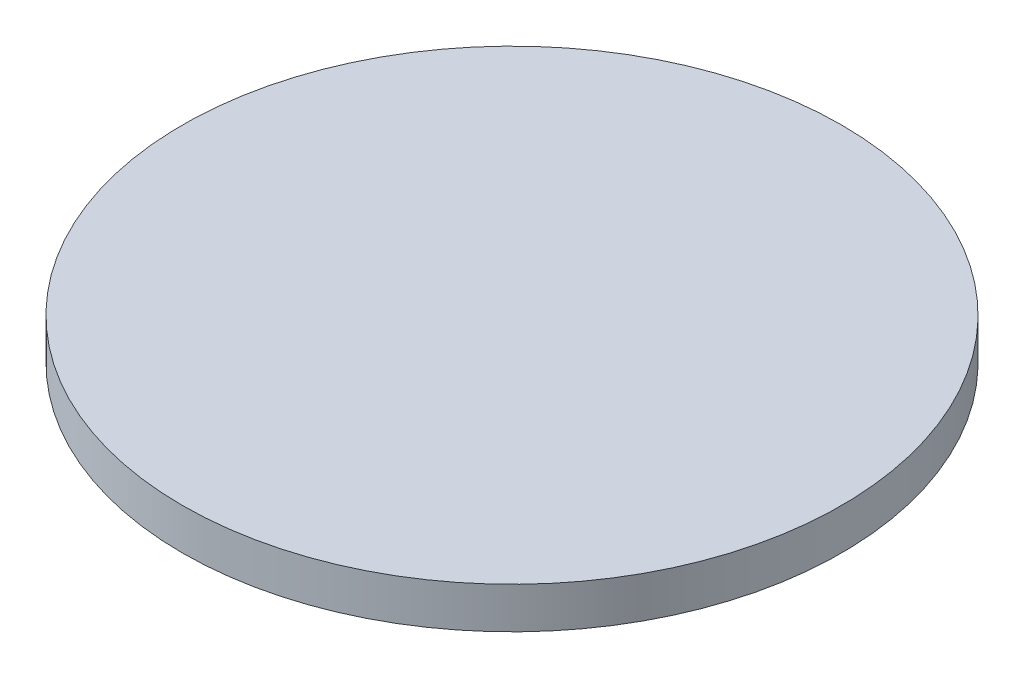
ISO-10303-21;
HEADER;
FILE_DESCRIPTION(('STEP AP214'),'2;1');
FILE_NAME('part.step','',(''),(''),'','','');
FILE_SCHEMA(('AUTOMOTIVE_DESIGN { 1 0 10303 214 1 1 1 1 }'));
ENDSEC;
DATA;
#1=APPLICATION_CONTEXT('core data for automotive mechanical design processes');
#2=APPLICATION_PROTOCOL_DEFINITION('international standard','automotive_design',2000,#1);
#3=PRODUCT_CONTEXT('',#1,'mechanical');
#4=PRODUCT('Part','Part','',(#3));
#5=PRODUCT_RELATED_PRODUCT_CATEGORY('part','',(#4));
#6=PRODUCT_DEFINITION_FORMATION('','',#4);
#7=PRODUCT_DEFINITION_CONTEXT('part definition',#1,'design');
#8=PRODUCT_DEFINITION('design','',#6,#7);
#9=PRODUCT_DEFINITION_SHAPE('','',#8);
#10=(LENGTH_UNIT() NAMED_UNIT(*) SI_UNIT(.MILLI.,.METRE.));
#11=(NAMED_UNIT(*) PLANE_ANGLE_UNIT() SI_UNIT($,.RADIAN.));
#12=(NAMED_UNIT(*) SI_UNIT($,.STERADIAN.) SOLID_ANGLE_UNIT());
#13=UNCERTAINTY_MEASURE_WITH_UNIT(LENGTH_MEASURE(1.E-05),#10,'distance_accuracy_value','');
#14=(GEOMETRIC_REPRESENTATION_CONTEXT(3) GLOBAL_UNCERTAINTY_ASSIGNED_CONTEXT((#13)) GLOBAL_UNIT_ASSIGNED_CONTEXT((#10,
#11,#12)) REPRESENTATION_CONTEXT('',''));
#15=CARTESIAN_POINT('',(0.,0.,0.));
#16=DIRECTION('',(0.,0.,1.));
#17=DIRECTION('',(1.,0.,0.));
#18=AXIS2_PLACEMENT_3D('',#15,#16,#17);
#19=CARTESIAN_POINT('',(185.,1790.,-300.));
#20=DIRECTION('',(0.,-1.,0.));
#21=DIRECTION('',(0.,0.,-1.));
#22=AXIS2_PLACEMENT_3D('',#19,#20,#21);
#23=CYLINDRICAL_SURFACE('',#22,160.);
#24=CARTESIAN_POINT('',(185.,1790.,-300.));
#25=DIRECTION('',(0.,1.,0.));
#26=DIRECTION('',(0.,0.,1.));
#27=AXIS2_PLACEMENT_3D('',#24,#25,#26);
#28=CIRCLE('',#27,160.);
#29=CARTESIAN_POINT('',(185.,1790.,-140.));
#30=VERTEX_POINT('',#29);
#31=EDGE_CURVE('E10',#30,#30,#28,.T.);
#32=ORIENTED_EDGE('',*,*,#31,.F.);
#33=EDGE_LOOP('',(#32));
#34=FACE_BOUND('',#33,.T.);
#35=CARTESIAN_POINT('',(185.,1770.,-300.));
#36=DIRECTION('',(0.,1.,0.));
#37=DIRECTION('',(0.,0.,1.));
#38=AXIS2_PLACEMENT_3D('',#35,#36,#37);
#39=CIRCLE('',#38,160.);
#40=CARTESIAN_POINT('',(185.,1770.,-140.));
#41=VERTEX_POINT('',#40);
#42=EDGE_CURVE('E40',#41,#41,#39,.T.);
#43=ORIENTED_EDGE('',*,*,#42,.T.);
#44=EDGE_LOOP('',(#43));
#45=FACE_BOUND('',#44,.T.);
#46=ADVANCED_FACE('F37',(#34,#45),#23,.T.);
#47=CARTESIAN_POINT('',(185.,1790.,-300.));
#48=DIRECTION('',(0.,1.,0.));
#49=DIRECTION('',(0.,0.,1.));
#50=AXIS2_PLACEMENT_3D('',#47,#48,#49);
#51=PLANE('',#50);
#52=ORIENTED_EDGE('',*,*,#31,.T.);
#53=EDGE_LOOP('',(#52));
#54=FACE_BOUND('',#53,.T.);
#55=ADVANCED_FACE('F52',(#54),#51,.T.);
#56=CARTESIAN_POINT('',(185.,1770.,-300.));
#57=DIRECTION('',(0.,1.,0.));
#58=DIRECTION('',(0.,0.,1.));
#59=AXIS2_PLACEMENT_3D('',#56,#57,#58);
#60=PLANE('',#59);
#61=ORIENTED_EDGE('',*,*,#42,.F.);
#62=EDGE_LOOP('',(#61));
#63=FACE_BOUND('',#62,.T.);
#64=ADVANCED_FACE('F50',(#63),#60,.F.);
#65=CLOSED_SHELL('',(#46,#55,#64));
#66=MANIFOLD_SOLID_BREP('B2',#65);
#67=ADVANCED_BREP_SHAPE_REPRESENTATION('',(#18,#66),#14);
#68=SHAPE_DEFINITION_REPRESENTATION(#9,#67);
ENDSEC;
END-ISO-10303-21;
